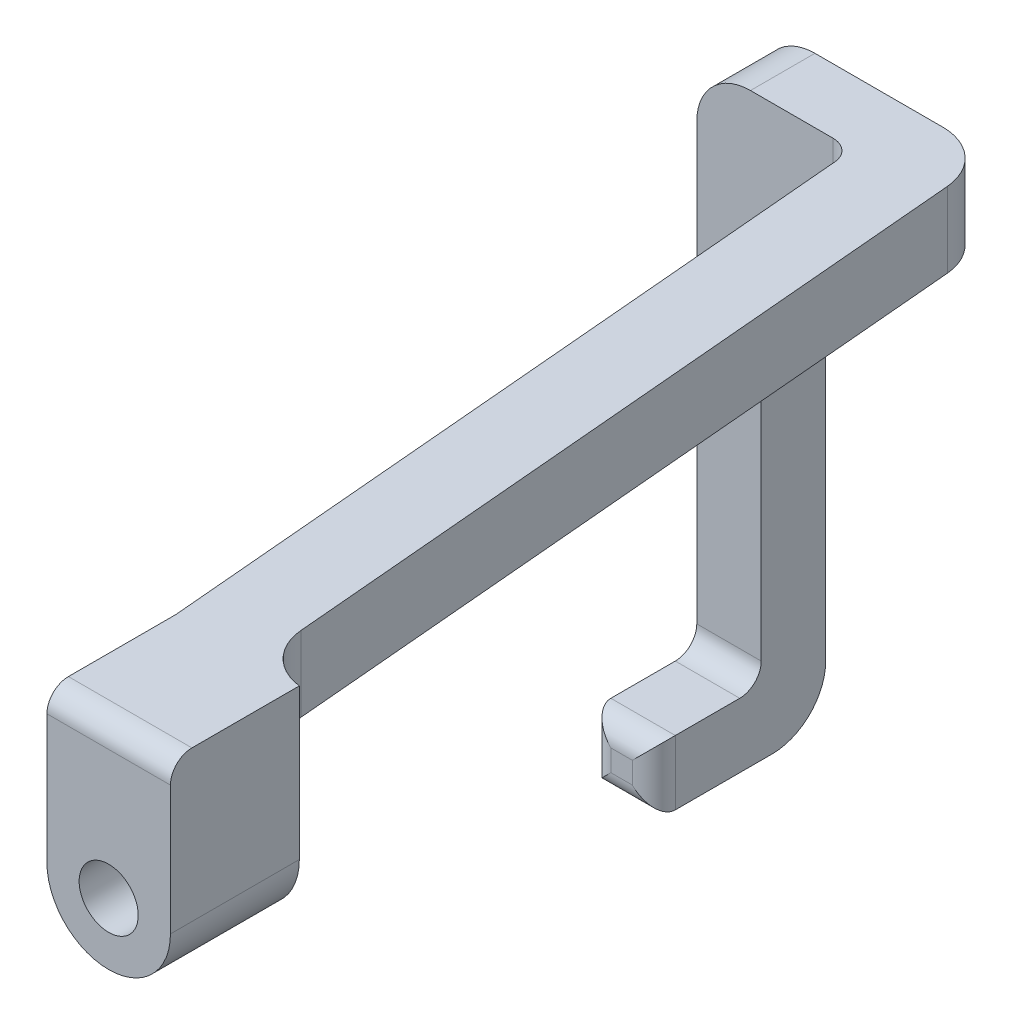
ISO-10303-21;
HEADER;
FILE_DESCRIPTION(('STEP AP214'),'2;1');
FILE_NAME('part.step','',(''),(''),'','','');
FILE_SCHEMA(('AUTOMOTIVE_DESIGN { 1 0 10303 214 1 1 1 1 }'));
ENDSEC;
DATA;
#1=APPLICATION_CONTEXT('core data for automotive mechanical design processes');
#2=APPLICATION_PROTOCOL_DEFINITION('international standard','automotive_design',2000,#1);
#3=PRODUCT_CONTEXT('',#1,'mechanical');
#4=PRODUCT('Part','Part','',(#3));
#5=PRODUCT_RELATED_PRODUCT_CATEGORY('part','',(#4));
#6=PRODUCT_DEFINITION_FORMATION('','',#4);
#7=PRODUCT_DEFINITION_CONTEXT('part definition',#1,'design');
#8=PRODUCT_DEFINITION('design','',#6,#7);
#9=PRODUCT_DEFINITION_SHAPE('','',#8);
#10=(LENGTH_UNIT() NAMED_UNIT(*) SI_UNIT(.MILLI.,.METRE.));
#11=(NAMED_UNIT(*) PLANE_ANGLE_UNIT() SI_UNIT($,.RADIAN.));
#12=(NAMED_UNIT(*) SI_UNIT($,.STERADIAN.) SOLID_ANGLE_UNIT());
#13=UNCERTAINTY_MEASURE_WITH_UNIT(LENGTH_MEASURE(1.E-05),#10,'distance_accuracy_value','');
#14=(GEOMETRIC_REPRESENTATION_CONTEXT(3) GLOBAL_UNCERTAINTY_ASSIGNED_CONTEXT((#13)) GLOBAL_UNIT_ASSIGNED_CONTEXT((#10,
#11,#12)) REPRESENTATION_CONTEXT('',''));
#15=CARTESIAN_POINT('',(0.,0.,0.));
#16=DIRECTION('',(0.,0.,1.));
#17=DIRECTION('',(1.,0.,0.));
#18=AXIS2_PLACEMENT_3D('',#15,#16,#17);
#19=CARTESIAN_POINT('',(-1.37658783702771,7.,-34.5));
#20=DIRECTION('',(0.,0.,-1.));
#21=DIRECTION('',(-1.,0.,0.));
#22=AXIS2_PLACEMENT_3D('',#19,#20,#21);
#23=PLANE('',#22);
#24=DIRECTION('',(-1.,0.,0.));
#25=VECTOR('',#24,1.);
#26=CARTESIAN_POINT('',(-1.37658783702771,3.5,-34.5));
#27=LINE('',#26,#25);
#28=CARTESIAN_POINT('',(-6.78208186315099,3.5,-34.5));
#29=VERTEX_POINT('',#28);
#30=CARTESIAN_POINT('',(-7.625,3.5,-34.5));
#31=VERTEX_POINT('',#30);
#32=EDGE_CURVE('E231',#29,#31,#27,.T.);
#33=ORIENTED_EDGE('',*,*,#32,.F.);
#34=DIRECTION('',(0.,-1.,0.));
#35=VECTOR('',#34,1.);
#36=CARTESIAN_POINT('',(-6.78208186315099,7.,-34.5));
#37=LINE('',#36,#35);
#38=CARTESIAN_POINT('',(-6.78208186315099,7.,-34.5));
#39=VERTEX_POINT('',#38);
#40=EDGE_CURVE('E459',#29,#39,#37,.F.);
#41=ORIENTED_EDGE('',*,*,#40,.T.);
#42=DIRECTION('',(-1.,0.,0.));
#43=VECTOR('',#42,1.);
#44=CARTESIAN_POINT('',(-1.37658783702771,7.,-34.5));
#45=LINE('',#44,#43);
#46=CARTESIAN_POINT('',(-10.625,7.,-34.5));
#47=VERTEX_POINT('',#46);
#48=EDGE_CURVE('E233',#39,#47,#45,.T.);
#49=ORIENTED_EDGE('',*,*,#48,.T.);
#50=CARTESIAN_POINT('',(-10.625,4.5,-34.5));
#51=DIRECTION('',(0.,0.,-1.));
#52=DIRECTION('',(-1.,0.,0.));
#53=AXIS2_PLACEMENT_3D('',#50,#51,#52);
#54=CIRCLE('',#53,2.5);
#55=CARTESIAN_POINT('',(-13.125,4.5,-34.5));
#56=VERTEX_POINT('',#55);
#57=EDGE_CURVE('E256',#47,#56,#54,.F.);
#58=ORIENTED_EDGE('',*,*,#57,.T.);
#59=DIRECTION('',(0.,-1.,0.));
#60=VECTOR('',#59,1.);
#61=CARTESIAN_POINT('',(-13.125,7.,-34.5));
#62=LINE('',#61,#60);
#63=CARTESIAN_POINT('',(-13.125,-15.75,-34.5));
#64=VERTEX_POINT('',#63);
#65=EDGE_CURVE('E235',#56,#64,#62,.T.);
#66=ORIENTED_EDGE('',*,*,#65,.T.);
#67=DIRECTION('',(-1.,0.,0.));
#68=VECTOR('',#67,1.);
#69=CARTESIAN_POINT('',(-10.125,-15.75,-34.5));
#70=LINE('',#69,#68);
#71=CARTESIAN_POINT('',(-10.125,-15.75,-34.5));
#72=VERTEX_POINT('',#71);
#73=EDGE_CURVE('E448',#64,#72,#70,.F.);
#74=ORIENTED_EDGE('',*,*,#73,.T.);
#75=DIRECTION('',(0.,1.,0.));
#76=VECTOR('',#75,1.);
#77=CARTESIAN_POINT('',(-10.125,-19.75,-34.5));
#78=LINE('',#77,#76);
#79=CARTESIAN_POINT('',(-10.125,0.999999999999994,-34.5));
#80=VERTEX_POINT('',#79);
#81=EDGE_CURVE('E437',#72,#80,#78,.T.);
#82=ORIENTED_EDGE('',*,*,#81,.T.);
#83=CARTESIAN_POINT('',(-7.625,1.,-34.5));
#84=DIRECTION('',(0.,0.,-1.));
#85=DIRECTION('',(-1.,0.,0.));
#86=AXIS2_PLACEMENT_3D('',#83,#84,#85);
#87=CIRCLE('',#86,2.5);
#88=EDGE_CURVE('E280',#80,#31,#87,.T.);
#89=ORIENTED_EDGE('',*,*,#88,.T.);
#90=EDGE_LOOP('',(#33,#41,#49,#58,#66,#74,#82,#89));
#91=FACE_BOUND('',#90,.T.);
#92=ADVANCED_FACE('F47',(#91),#23,.F.);
#93=CARTESIAN_POINT('',(-2.85356654462041,0.,0.247309100533769));
#94=DIRECTION('',(0.996265469182466,0.,-0.0863430073291471));
#95=DIRECTION('',(-0.0863430073291471,0.,-0.996265469182466));
#96=AXIS2_PLACEMENT_3D('',#93,#94,#95);
#97=PLANE('',#96);
#98=DIRECTION('',(-0.0863430073291471,0.,-0.996265469182466));
#99=VECTOR('',#98,1.);
#100=CARTESIAN_POINT('',(-2.875,7.,0.));
#101=LINE('',#100,#99);
#102=CARTESIAN_POINT('',(-2.875,7.,0.));
#103=VERTEX_POINT('',#102);
#104=CARTESIAN_POINT('',(-5.78581639396853,7.,-33.5863430073291));
#105=VERTEX_POINT('',#104);
#106=EDGE_CURVE('E404',#103,#105,#101,.T.);
#107=ORIENTED_EDGE('',*,*,#106,.T.);
#108=DIRECTION('',(0.,-1.,0.));
#109=VECTOR('',#108,1.);
#110=CARTESIAN_POINT('',(-5.78581639396853,3.5,-33.5863430073291));
#111=LINE('',#110,#109);
#112=CARTESIAN_POINT('',(-5.78581639396853,3.5,-33.5863430073291));
#113=VERTEX_POINT('',#112);
#114=EDGE_CURVE('E476',#105,#113,#111,.T.);
#115=ORIENTED_EDGE('',*,*,#114,.T.);
#116=DIRECTION('',(-0.086343007329147,0.,-0.996265469182466));
#117=VECTOR('',#116,1.);
#118=CARTESIAN_POINT('',(-2.875,3.5,0.));
#119=LINE('',#118,#117);
#120=CARTESIAN_POINT('',(-2.875,3.5,0.));
#121=VERTEX_POINT('',#120);
#122=EDGE_CURVE('E356',#121,#113,#119,.T.);
#123=ORIENTED_EDGE('',*,*,#122,.F.);
#124=DIRECTION('',(0.,1.,0.));
#125=VECTOR('',#124,1.);
#126=CARTESIAN_POINT('',(-2.875,0.,0.));
#127=LINE('',#126,#125);
#128=EDGE_CURVE('E242',#103,#121,#127,.F.);
#129=ORIENTED_EDGE('',*,*,#128,.F.);
#130=EDGE_LOOP('',(#107,#115,#123,#129));
#131=FACE_BOUND('',#130,.T.);
#132=ADVANCED_FACE('F317',(#131),#97,.F.);
#133=CARTESIAN_POINT('',(0.,0.,6.));
#134=DIRECTION('',(0.,0.,1.));
#135=DIRECTION('',(1.,0.,0.));
#136=AXIS2_PLACEMENT_3D('',#133,#134,#135);
#137=PLANE('',#136);
#138=DIRECTION('',(0.,1.,0.));
#139=VECTOR('',#138,1.);
#140=CARTESIAN_POINT('',(2.875,0.,6.));
#141=LINE('',#140,#139);
#142=CARTESIAN_POINT('',(2.875,0.,6.));
#143=VERTEX_POINT('',#142);
#144=CARTESIAN_POINT('',(2.875,6.,6.));
#145=VERTEX_POINT('',#144);
#146=EDGE_CURVE('E380',#143,#145,#141,.T.);
#147=ORIENTED_EDGE('',*,*,#146,.T.);
#148=DIRECTION('',(-1.,0.,0.));
#149=VECTOR('',#148,1.);
#150=CARTESIAN_POINT('',(-2.875,6.,6.));
#151=LINE('',#150,#149);
#152=CARTESIAN_POINT('',(-2.875,6.,6.));
#153=VERTEX_POINT('',#152);
#154=EDGE_CURVE('E478',#145,#153,#151,.T.);
#155=ORIENTED_EDGE('',*,*,#154,.T.);
#156=DIRECTION('',(0.,-1.,0.));
#157=VECTOR('',#156,1.);
#158=CARTESIAN_POINT('',(-2.875,0.,6.));
#159=LINE('',#158,#157);
#160=CARTESIAN_POINT('',(-2.875,0.,6.));
#161=VERTEX_POINT('',#160);
#162=EDGE_CURVE('E368',#153,#161,#159,.T.);
#163=ORIENTED_EDGE('',*,*,#162,.T.);
#164=CARTESIAN_POINT('',(0.,0.,6.));
#165=DIRECTION('',(0.,0.,1.));
#166=DIRECTION('',(1.,0.,0.));
#167=AXIS2_PLACEMENT_3D('',#164,#165,#166);
#168=CIRCLE('',#167,2.875);
#169=EDGE_CURVE('E383',#161,#143,#168,.T.);
#170=ORIENTED_EDGE('',*,*,#169,.T.);
#171=EDGE_LOOP('',(#147,#155,#163,#170));
#172=FACE_BOUND('',#171,.T.);
#173=CARTESIAN_POINT('',(0.,0.,6.));
#174=DIRECTION('',(0.,0.,1.));
#175=DIRECTION('',(1.,0.,0.));
#176=AXIS2_PLACEMENT_3D('',#173,#174,#175);
#177=CIRCLE('',#176,1.375);
#178=CARTESIAN_POINT('',(1.375,0.,6.));
#179=VERTEX_POINT('',#178);
#180=EDGE_CURVE('E378',#179,#179,#177,.T.);
#181=ORIENTED_EDGE('',*,*,#180,.F.);
#182=EDGE_LOOP('',(#181));
#183=FACE_BOUND('',#182,.T.);
#184=ADVANCED_FACE('F324',(#172,#183),#137,.T.);
#185=CARTESIAN_POINT('',(0.,0.,0.));
#186=DIRECTION('',(0.,0.,1.));
#187=DIRECTION('',(1.,0.,0.));
#188=AXIS2_PLACEMENT_3D('',#185,#186,#187);
#189=PLANE('',#188);
#190=DIRECTION('',(-1.,0.,0.));
#191=VECTOR('',#190,1.);
#192=CARTESIAN_POINT('',(-2.875,3.5,0.));
#193=LINE('',#192,#191);
#194=CARTESIAN_POINT('',(2.875,3.5,0.));
#195=VERTEX_POINT('',#194);
#196=EDGE_CURVE('E353',#195,#121,#193,.T.);
#197=ORIENTED_EDGE('',*,*,#196,.F.);
#198=DIRECTION('',(0.,1.,0.));
#199=VECTOR('',#198,1.);
#200=CARTESIAN_POINT('',(2.875,0.,0.));
#201=LINE('',#200,#199);
#202=CARTESIAN_POINT('',(2.875,0.,0.));
#203=VERTEX_POINT('',#202);
#204=EDGE_CURVE('E371',#203,#195,#201,.T.);
#205=ORIENTED_EDGE('',*,*,#204,.F.);
#206=CARTESIAN_POINT('',(0.,0.,0.));
#207=DIRECTION('',(0.,0.,1.));
#208=DIRECTION('',(1.,0.,0.));
#209=AXIS2_PLACEMENT_3D('',#206,#207,#208);
#210=CIRCLE('',#209,2.875);
#211=CARTESIAN_POINT('',(-2.875,0.,0.));
#212=VERTEX_POINT('',#211);
#213=EDGE_CURVE('E375',#212,#203,#210,.T.);
#214=ORIENTED_EDGE('',*,*,#213,.F.);
#215=DIRECTION('',(0.,-1.,0.));
#216=VECTOR('',#215,1.);
#217=CARTESIAN_POINT('',(-2.875,0.,0.));
#218=LINE('',#217,#216);
#219=EDGE_CURVE('E369',#121,#212,#218,.T.);
#220=ORIENTED_EDGE('',*,*,#219,.F.);
#221=EDGE_LOOP('',(#197,#205,#214,#220));
#222=FACE_BOUND('',#221,.T.);
#223=CARTESIAN_POINT('',(0.,0.,0.));
#224=DIRECTION('',(0.,0.,1.));
#225=DIRECTION('',(1.,0.,0.));
#226=AXIS2_PLACEMENT_3D('',#223,#224,#225);
#227=CIRCLE('',#226,1.375);
#228=CARTESIAN_POINT('',(1.375,0.,0.));
#229=VERTEX_POINT('',#228);
#230=EDGE_CURVE('E386',#229,#229,#227,.T.);
#231=ORIENTED_EDGE('',*,*,#230,.T.);
#232=EDGE_LOOP('',(#231));
#233=FACE_BOUND('',#232,.T.);
#234=ADVANCED_FACE('F327',(#222,#233),#189,.F.);
#235=CARTESIAN_POINT('',(0.,0.,6.));
#236=DIRECTION('',(0.,0.,-1.));
#237=DIRECTION('',(-1.,0.,0.));
#238=AXIS2_PLACEMENT_3D('',#235,#236,#237);
#239=CYLINDRICAL_SURFACE('',#238,2.875);
#240=ORIENTED_EDGE('',*,*,#213,.T.);
#241=DIRECTION('',(0.,0.,-1.));
#242=VECTOR('',#241,1.);
#243=CARTESIAN_POINT('',(2.875,0.,6.));
#244=LINE('',#243,#242);
#245=EDGE_CURVE('E361',#143,#203,#244,.T.);
#246=ORIENTED_EDGE('',*,*,#245,.F.);
#247=ORIENTED_EDGE('',*,*,#169,.F.);
#248=DIRECTION('',(0.,0.,-1.));
#249=VECTOR('',#248,1.);
#250=CARTESIAN_POINT('',(-2.875,0.,6.));
#251=LINE('',#250,#249);
#252=EDGE_CURVE('E360',#161,#212,#251,.T.);
#253=ORIENTED_EDGE('',*,*,#252,.T.);
#254=EDGE_LOOP('',(#240,#246,#247,#253));
#255=FACE_BOUND('',#254,.T.);
#256=ADVANCED_FACE('F331',(#255),#239,.T.);
#257=CARTESIAN_POINT('',(2.875,0.,6.));
#258=DIRECTION('',(-1.,0.,0.));
#259=DIRECTION('',(0.,-1.,0.));
#260=AXIS2_PLACEMENT_3D('',#257,#258,#259);
#261=PLANE('',#260);
#262=DIRECTION('',(0.,0.,-1.));
#263=VECTOR('',#262,1.);
#264=CARTESIAN_POINT('',(2.875,7.,6.));
#265=LINE('',#264,#263);
#266=CARTESIAN_POINT('',(2.875,7.,5.));
#267=VERTEX_POINT('',#266);
#268=CARTESIAN_POINT('',(2.875,7.,0.));
#269=VERTEX_POINT('',#268);
#270=EDGE_CURVE('E359',#267,#269,#265,.T.);
#271=ORIENTED_EDGE('',*,*,#270,.F.);
#272=CARTESIAN_POINT('',(2.875,6.,5.));
#273=DIRECTION('',(-1.,0.,0.));
#274=DIRECTION('',(0.,-1.,0.));
#275=AXIS2_PLACEMENT_3D('',#272,#273,#274);
#276=CIRCLE('',#275,1.);
#277=EDGE_CURVE('E488',#267,#145,#276,.F.);
#278=ORIENTED_EDGE('',*,*,#277,.T.);
#279=ORIENTED_EDGE('',*,*,#146,.F.);
#280=ORIENTED_EDGE('',*,*,#245,.T.);
#281=ORIENTED_EDGE('',*,*,#204,.T.);
#282=EDGE_CURVE('E374',#195,#269,#201,.T.);
#283=ORIENTED_EDGE('',*,*,#282,.T.);
#284=EDGE_LOOP('',(#271,#278,#279,#280,#281,#283));
#285=FACE_BOUND('',#284,.T.);
#286=ADVANCED_FACE('F339',(#285),#261,.F.);
#287=CARTESIAN_POINT('',(2.875,7.,6.));
#288=DIRECTION('',(0.,-1.,0.));
#289=DIRECTION('',(0.,0.,-1.));
#290=AXIS2_PLACEMENT_3D('',#287,#288,#289);
#291=PLANE('',#290);
#292=DIRECTION('',(0.,0.,-1.));
#293=VECTOR('',#292,1.);
#294=CARTESIAN_POINT('',(-2.875,7.,6.));
#295=LINE('',#294,#293);
#296=CARTESIAN_POINT('',(-2.875,7.,5.));
#297=VERTEX_POINT('',#296);
#298=EDGE_CURVE('E357',#297,#103,#295,.T.);
#299=ORIENTED_EDGE('',*,*,#298,.F.);
#300=DIRECTION('',(-1.,0.,0.));
#301=VECTOR('',#300,1.);
#302=CARTESIAN_POINT('',(2.875,7.,5.));
#303=LINE('',#302,#301);
#304=EDGE_CURVE('E64',#297,#267,#303,.F.);
#305=ORIENTED_EDGE('',*,*,#304,.T.);
#306=ORIENTED_EDGE('',*,*,#270,.T.);
#307=CARTESIAN_POINT('',(3.16921025672152,7.,-2.48262770564575));
#308=DIRECTION('',(0.,-1.,0.));
#309=DIRECTION('',(0.,0.,-1.));
#310=AXIS2_PLACEMENT_3D('',#307,#308,#309);
#311=CIRCLE('',#310,2.5);
#312=CARTESIAN_POINT('',(0.678546583765352,7.,-2.26677018732288));
#313=VERTEX_POINT('',#312);
#314=EDGE_CURVE('E286',#269,#313,#311,.T.);
#315=ORIENTED_EDGE('',*,*,#314,.T.);
#316=DIRECTION('',(-0.0863430073291471,0.,-0.996265469182466));
#317=VECTOR('',#316,1.);
#318=CARTESIAN_POINT('',(0.875000000000001,7.,0.));
#319=LINE('',#318,#317);
#320=CARTESIAN_POINT('',(-2.17704098492132,7.,-35.2158575183229));
#321=VERTEX_POINT('',#320);
#322=EDGE_CURVE('E222',#313,#321,#319,.T.);
#323=ORIENTED_EDGE('',*,*,#322,.T.);
#324=CARTESIAN_POINT('',(-4.66770465787748,7.,-35.));
#325=DIRECTION('',(0.,-1.,0.));
#326=DIRECTION('',(0.,0.,-1.));
#327=AXIS2_PLACEMENT_3D('',#324,#325,#326);
#328=CIRCLE('',#327,2.5);
#329=CARTESIAN_POINT('',(-4.66770465787748,7.,-37.5));
#330=VERTEX_POINT('',#329);
#331=EDGE_CURVE('E248',#321,#330,#328,.F.);
#332=ORIENTED_EDGE('',*,*,#331,.T.);
#333=DIRECTION('',(1.,0.,0.));
#334=VECTOR('',#333,1.);
#335=CARTESIAN_POINT('',(-2.375,7.,-37.5));
#336=LINE('',#335,#334);
#337=CARTESIAN_POINT('',(-6.125,7.,-37.5));
#338=VERTEX_POINT('',#337);
#339=EDGE_CURVE('E221',#338,#330,#336,.T.);
#340=ORIENTED_EDGE('',*,*,#339,.F.);
#341=DIRECTION('',(1.,0.,0.));
#342=VECTOR('',#341,1.);
#343=CARTESIAN_POINT('',(-13.125,7.,-37.5));
#344=LINE('',#343,#342);
#345=CARTESIAN_POINT('',(-10.625,7.,-37.5));
#346=VERTEX_POINT('',#345);
#347=EDGE_CURVE('E232',#346,#338,#344,.T.);
#348=ORIENTED_EDGE('',*,*,#347,.F.);
#349=DIRECTION('',(0.,0.,1.));
#350=VECTOR('',#349,1.);
#351=CARTESIAN_POINT('',(-10.625,7.,6.));
#352=LINE('',#351,#350);
#353=EDGE_CURVE('E250',#346,#47,#352,.T.);
#354=ORIENTED_EDGE('',*,*,#353,.T.);
#355=ORIENTED_EDGE('',*,*,#48,.F.);
#356=CARTESIAN_POINT('',(-6.78208186315099,7.,-33.5));
#357=DIRECTION('',(0.,-1.,0.));
#358=DIRECTION('',(0.,0.,-1.));
#359=AXIS2_PLACEMENT_3D('',#356,#357,#358);
#360=CIRCLE('',#359,1.);
#361=EDGE_CURVE('E408',#39,#105,#360,.T.);
#362=ORIENTED_EDGE('',*,*,#361,.T.);
#363=ORIENTED_EDGE('',*,*,#106,.F.);
#364=EDGE_LOOP('',(#299,#305,#306,#315,#323,#332,#340,#348,#354,#355,#362,#363));
#365=FACE_BOUND('',#364,.T.);
#366=ADVANCED_FACE('F335',(#365),#291,.F.);
#367=CARTESIAN_POINT('',(-2.875,0.,6.));
#368=DIRECTION('',(1.,0.,0.));
#369=DIRECTION('',(0.,1.,0.));
#370=AXIS2_PLACEMENT_3D('',#367,#368,#369);
#371=PLANE('',#370);
#372=ORIENTED_EDGE('',*,*,#162,.F.);
#373=CARTESIAN_POINT('',(-2.875,6.,5.));
#374=DIRECTION('',(1.,0.,0.));
#375=DIRECTION('',(0.,1.,0.));
#376=AXIS2_PLACEMENT_3D('',#373,#374,#375);
#377=CIRCLE('',#376,1.);
#378=EDGE_CURVE('E72',#153,#297,#377,.F.);
#379=ORIENTED_EDGE('',*,*,#378,.T.);
#380=ORIENTED_EDGE('',*,*,#298,.T.);
#381=ORIENTED_EDGE('',*,*,#128,.T.);
#382=ORIENTED_EDGE('',*,*,#219,.T.);
#383=ORIENTED_EDGE('',*,*,#252,.F.);
#384=EDGE_LOOP('',(#372,#379,#380,#381,#382,#383));
#385=FACE_BOUND('',#384,.T.);
#386=ADVANCED_FACE('F322',(#385),#371,.F.);
#387=CARTESIAN_POINT('',(0.,0.,6.));
#388=DIRECTION('',(0.,0.,-1.));
#389=DIRECTION('',(-1.,0.,0.));
#390=AXIS2_PLACEMENT_3D('',#387,#388,#389);
#391=CYLINDRICAL_SURFACE('',#390,1.375);
#392=ORIENTED_EDGE('',*,*,#180,.T.);
#393=EDGE_LOOP('',(#392));
#394=FACE_BOUND('',#393,.T.);
#395=ORIENTED_EDGE('',*,*,#230,.F.);
#396=EDGE_LOOP('',(#395));
#397=FACE_BOUND('',#396,.T.);
#398=ADVANCED_FACE('F316',(#394,#397),#391,.F.);
#399=CARTESIAN_POINT('',(0.,0.,-37.5));
#400=DIRECTION('',(0.,0.,1.));
#401=DIRECTION('',(1.,0.,0.));
#402=AXIS2_PLACEMENT_3D('',#399,#400,#401);
#403=PLANE('',#402);
#404=DIRECTION('',(0.,1.,0.));
#405=VECTOR('',#404,1.);
#406=CARTESIAN_POINT('',(-13.125,7.,-37.5));
#407=LINE('',#406,#405);
#408=CARTESIAN_POINT('',(-13.125,-17.25,-37.5));
#409=VERTEX_POINT('',#408);
#410=CARTESIAN_POINT('',(-13.125,4.5,-37.5));
#411=VERTEX_POINT('',#410);
#412=EDGE_CURVE('E451',#409,#411,#407,.T.);
#413=ORIENTED_EDGE('',*,*,#412,.T.);
#414=CARTESIAN_POINT('',(-10.625,4.5,-37.5));
#415=DIRECTION('',(0.,0.,1.));
#416=DIRECTION('',(1.,0.,0.));
#417=AXIS2_PLACEMENT_3D('',#414,#415,#416);
#418=CIRCLE('',#417,2.5);
#419=EDGE_CURVE('E268',#411,#346,#418,.F.);
#420=ORIENTED_EDGE('',*,*,#419,.T.);
#421=ORIENTED_EDGE('',*,*,#347,.T.);
#422=ORIENTED_EDGE('',*,*,#339,.T.);
#423=DIRECTION('',(0.,-1.,0.));
#424=VECTOR('',#423,1.);
#425=CARTESIAN_POINT('',(-4.66770465787748,0.,-37.5));
#426=LINE('',#425,#424);
#427=CARTESIAN_POINT('',(-4.66770465787748,3.5,-37.5));
#428=VERTEX_POINT('',#427);
#429=EDGE_CURVE('E218',#330,#428,#426,.T.);
#430=ORIENTED_EDGE('',*,*,#429,.T.);
#431=DIRECTION('',(-1.,0.,0.));
#432=VECTOR('',#431,1.);
#433=CARTESIAN_POINT('',(-6.125,3.5,-37.5));
#434=LINE('',#433,#432);
#435=CARTESIAN_POINT('',(-6.125,3.5,-37.5));
#436=VERTEX_POINT('',#435);
#437=EDGE_CURVE('E210',#428,#436,#434,.T.);
#438=ORIENTED_EDGE('',*,*,#437,.T.);
#439=DIRECTION('',(1.,0.,0.));
#440=VECTOR('',#439,1.);
#441=CARTESIAN_POINT('',(-13.125,3.5,-37.5));
#442=LINE('',#441,#440);
#443=CARTESIAN_POINT('',(-7.625,3.5,-37.5));
#444=VERTEX_POINT('',#443);
#445=EDGE_CURVE('E215',#444,#436,#442,.T.);
#446=ORIENTED_EDGE('',*,*,#445,.F.);
#447=CARTESIAN_POINT('',(-7.625,1.,-37.5));
#448=DIRECTION('',(0.,0.,1.));
#449=DIRECTION('',(1.,0.,0.));
#450=AXIS2_PLACEMENT_3D('',#447,#448,#449);
#451=CIRCLE('',#450,2.5);
#452=CARTESIAN_POINT('',(-10.125,0.999999999999994,-37.5));
#453=VERTEX_POINT('',#452);
#454=EDGE_CURVE('E278',#444,#453,#451,.T.);
#455=ORIENTED_EDGE('',*,*,#454,.T.);
#456=DIRECTION('',(0.,1.,0.));
#457=VECTOR('',#456,1.);
#458=CARTESIAN_POINT('',(-10.125,-19.75,-37.5));
#459=LINE('',#458,#457);
#460=CARTESIAN_POINT('',(-10.125,-17.25,-37.5));
#461=VERTEX_POINT('',#460);
#462=EDGE_CURVE('E440',#461,#453,#459,.T.);
#463=ORIENTED_EDGE('',*,*,#462,.F.);
#464=DIRECTION('',(-1.,0.,0.));
#465=VECTOR('',#464,1.);
#466=CARTESIAN_POINT('',(0.,-17.25,-37.5));
#467=LINE('',#466,#465);
#468=EDGE_CURVE('E263',#461,#409,#467,.T.);
#469=ORIENTED_EDGE('',*,*,#468,.T.);
#470=EDGE_LOOP('',(#413,#420,#421,#422,#430,#438,#446,#455,#463,#469));
#471=FACE_BOUND('',#470,.T.);
#472=ADVANCED_FACE('F214',(#471),#403,.F.);
#473=CARTESIAN_POINT('',(0.,3.5,0.));
#474=DIRECTION('',(0.,1.,0.));
#475=DIRECTION('',(-1.,0.,0.));
#476=AXIS2_PLACEMENT_3D('',#473,#474,#475);
#477=PLANE('',#476);
#478=ORIENTED_EDGE('',*,*,#122,.T.);
#479=CARTESIAN_POINT('',(-6.78208186315099,3.5,-33.5));
#480=DIRECTION('',(0.,1.,0.));
#481=DIRECTION('',(-1.,0.,0.));
#482=AXIS2_PLACEMENT_3D('',#479,#480,#481);
#483=CIRCLE('',#482,1.);
#484=EDGE_CURVE('E490',#113,#29,#483,.T.);
#485=ORIENTED_EDGE('',*,*,#484,.T.);
#486=ORIENTED_EDGE('',*,*,#32,.T.);
#487=DIRECTION('',(0.,0.,-1.));
#488=VECTOR('',#487,1.);
#489=CARTESIAN_POINT('',(-7.625,3.5,0.));
#490=LINE('',#489,#488);
#491=EDGE_CURVE('E230',#31,#444,#490,.T.);
#492=ORIENTED_EDGE('',*,*,#491,.T.);
#493=ORIENTED_EDGE('',*,*,#445,.T.);
#494=ORIENTED_EDGE('',*,*,#437,.F.);
#495=CARTESIAN_POINT('',(-4.66770465787748,3.5,-35.));
#496=DIRECTION('',(0.,1.,0.));
#497=DIRECTION('',(-1.,0.,0.));
#498=AXIS2_PLACEMENT_3D('',#495,#496,#497);
#499=CIRCLE('',#498,2.5);
#500=CARTESIAN_POINT('',(-2.17704098492132,3.5,-35.2158575183229));
#501=VERTEX_POINT('',#500);
#502=EDGE_CURVE('E364',#428,#501,#499,.F.);
#503=ORIENTED_EDGE('',*,*,#502,.T.);
#504=DIRECTION('',(-0.086343007329147,0.,-0.996265469182466));
#505=VECTOR('',#504,1.);
#506=CARTESIAN_POINT('',(0.875000000000001,3.5,0.));
#507=LINE('',#506,#505);
#508=CARTESIAN_POINT('',(0.678546583765352,3.5,-2.26677018732288));
#509=VERTEX_POINT('',#508);
#510=EDGE_CURVE('E409',#509,#501,#507,.T.);
#511=ORIENTED_EDGE('',*,*,#510,.F.);
#512=CARTESIAN_POINT('',(3.16921025672152,3.5,-2.48262770564575));
#513=DIRECTION('',(0.,1.,0.));
#514=DIRECTION('',(-1.,0.,0.));
#515=AXIS2_PLACEMENT_3D('',#512,#513,#514);
#516=CIRCLE('',#515,2.5);
#517=EDGE_CURVE('E283',#509,#195,#516,.T.);
#518=ORIENTED_EDGE('',*,*,#517,.T.);
#519=ORIENTED_EDGE('',*,*,#196,.T.);
#520=EDGE_LOOP('',(#478,#485,#486,#492,#493,#494,#503,#511,#518,#519));
#521=FACE_BOUND('',#520,.T.);
#522=ADVANCED_FACE('F228',(#521),#477,.F.);
#523=CARTESIAN_POINT('',(0.86847677444969,0.,-0.0752679871189732));
#524=DIRECTION('',(-0.996265469182466,0.,0.086343007329147));
#525=DIRECTION('',(0.086343007329147,0.,0.996265469182466));
#526=AXIS2_PLACEMENT_3D('',#523,#524,#525);
#527=PLANE('',#526);
#528=ORIENTED_EDGE('',*,*,#510,.T.);
#529=DIRECTION('',(0.,-1.,0.));
#530=VECTOR('',#529,1.);
#531=CARTESIAN_POINT('',(-2.17704098492131,0.,-35.2158575183229));
#532=LINE('',#531,#530);
#533=EDGE_CURVE('E276',#501,#321,#532,.F.);
#534=ORIENTED_EDGE('',*,*,#533,.T.);
#535=ORIENTED_EDGE('',*,*,#322,.F.);
#536=DIRECTION('',(0.,-1.,0.));
#537=VECTOR('',#536,1.);
#538=CARTESIAN_POINT('',(0.678546583765352,0.,-2.26677018732288));
#539=LINE('',#538,#537);
#540=EDGE_CURVE('E273',#313,#509,#539,.T.);
#541=ORIENTED_EDGE('',*,*,#540,.T.);
#542=EDGE_LOOP('',(#528,#534,#535,#541));
#543=FACE_BOUND('',#542,.T.);
#544=ADVANCED_FACE('F575',(#543),#527,.F.);
#545=CARTESIAN_POINT('',(-13.125,0.,0.));
#546=DIRECTION('',(1.,0.,0.));
#547=DIRECTION('',(0.,0.,-1.));
#548=AXIS2_PLACEMENT_3D('',#545,#546,#547);
#549=PLANE('',#548);
#550=DIRECTION('',(0.,0.,1.));
#551=VECTOR('',#550,1.);
#552=CARTESIAN_POINT('',(-13.125,-19.75,0.));
#553=LINE('',#552,#551);
#554=CARTESIAN_POINT('',(-13.125,-19.75,-35.));
#555=VERTEX_POINT('',#554);
#556=CARTESIAN_POINT('',(-13.125,-19.75,-30.5));
#557=VERTEX_POINT('',#556);
#558=EDGE_CURVE('E453',#555,#557,#553,.T.);
#559=ORIENTED_EDGE('',*,*,#558,.T.);
#560=DIRECTION('',(0.,-1.,0.));
#561=VECTOR('',#560,1.);
#562=CARTESIAN_POINT('',(-13.125,0.,-30.5));
#563=LINE('',#562,#561);
#564=CARTESIAN_POINT('',(-13.125,-16.75,-30.5));
#565=VERTEX_POINT('',#564);
#566=EDGE_CURVE('E516',#557,#565,#563,.F.);
#567=ORIENTED_EDGE('',*,*,#566,.T.);
#568=DIRECTION('',(0.,0.,-1.));
#569=VECTOR('',#568,1.);
#570=CARTESIAN_POINT('',(-13.125,-16.75,-29.5));
#571=LINE('',#570,#569);
#572=CARTESIAN_POINT('',(-13.125,-16.75,-33.5));
#573=VERTEX_POINT('',#572);
#574=EDGE_CURVE('E510',#565,#573,#571,.T.);
#575=ORIENTED_EDGE('',*,*,#574,.T.);
#576=CARTESIAN_POINT('',(-13.125,-15.75,-33.5));
#577=DIRECTION('',(1.,0.,0.));
#578=DIRECTION('',(0.,0.,-1.));
#579=AXIS2_PLACEMENT_3D('',#576,#577,#578);
#580=CIRCLE('',#579,1.);
#581=EDGE_CURVE('E56',#573,#64,#580,.T.);
#582=ORIENTED_EDGE('',*,*,#581,.T.);
#583=ORIENTED_EDGE('',*,*,#65,.F.);
#584=DIRECTION('',(0.,0.,1.));
#585=VECTOR('',#584,1.);
#586=CARTESIAN_POINT('',(-13.125,4.5,0.));
#587=LINE('',#586,#585);
#588=EDGE_CURVE('E260',#56,#411,#587,.F.);
#589=ORIENTED_EDGE('',*,*,#588,.T.);
#590=ORIENTED_EDGE('',*,*,#412,.F.);
#591=CARTESIAN_POINT('',(-13.125,-17.25,-35.));
#592=DIRECTION('',(1.,0.,0.));
#593=DIRECTION('',(0.,0.,-1.));
#594=AXIS2_PLACEMENT_3D('',#591,#592,#593);
#595=CIRCLE('',#594,2.5);
#596=EDGE_CURVE('E258',#409,#555,#595,.F.);
#597=ORIENTED_EDGE('',*,*,#596,.T.);
#598=EDGE_LOOP('',(#559,#567,#575,#582,#583,#589,#590,#597));
#599=FACE_BOUND('',#598,.T.);
#600=ADVANCED_FACE('F469',(#599),#549,.F.);
#601=CARTESIAN_POINT('',(-10.125,-19.75,0.));
#602=DIRECTION('',(1.,0.,0.));
#603=DIRECTION('',(0.,0.,-1.));
#604=AXIS2_PLACEMENT_3D('',#601,#602,#603);
#605=PLANE('',#604);
#606=DIRECTION('',(0.,0.,-1.));
#607=VECTOR('',#606,1.);
#608=CARTESIAN_POINT('',(-10.125,-16.75,-29.5));
#609=LINE('',#608,#607);
#610=CARTESIAN_POINT('',(-10.125,-16.75,-30.5));
#611=VERTEX_POINT('',#610);
#612=CARTESIAN_POINT('',(-10.125,-16.75,-33.5));
#613=VERTEX_POINT('',#612);
#614=EDGE_CURVE('E504',#611,#613,#609,.T.);
#615=ORIENTED_EDGE('',*,*,#614,.F.);
#616=DIRECTION('',(0.,1.,0.));
#617=VECTOR('',#616,1.);
#618=CARTESIAN_POINT('',(-10.125,-19.75,-30.5));
#619=LINE('',#618,#617);
#620=CARTESIAN_POINT('',(-10.125,-19.75,-30.5));
#621=VERTEX_POINT('',#620);
#622=EDGE_CURVE('E527',#611,#621,#619,.F.);
#623=ORIENTED_EDGE('',*,*,#622,.T.);
#624=DIRECTION('',(0.,0.,-1.));
#625=VECTOR('',#624,1.);
#626=CARTESIAN_POINT('',(-10.125,-19.75,0.));
#627=LINE('',#626,#625);
#628=CARTESIAN_POINT('',(-10.125,-19.75,-35.));
#629=VERTEX_POINT('',#628);
#630=EDGE_CURVE('E449',#621,#629,#627,.T.);
#631=ORIENTED_EDGE('',*,*,#630,.T.);
#632=CARTESIAN_POINT('',(-10.125,-17.25,-35.));
#633=DIRECTION('',(1.,0.,0.));
#634=DIRECTION('',(0.,0.,-1.));
#635=AXIS2_PLACEMENT_3D('',#632,#633,#634);
#636=CIRCLE('',#635,2.5);
#637=EDGE_CURVE('E428',#629,#461,#636,.T.);
#638=ORIENTED_EDGE('',*,*,#637,.T.);
#639=ORIENTED_EDGE('',*,*,#462,.T.);
#640=DIRECTION('',(0.,0.,-1.));
#641=VECTOR('',#640,1.);
#642=CARTESIAN_POINT('',(-10.125,1.,0.));
#643=LINE('',#642,#641);
#644=EDGE_CURVE('E251',#453,#80,#643,.F.);
#645=ORIENTED_EDGE('',*,*,#644,.T.);
#646=ORIENTED_EDGE('',*,*,#81,.F.);
#647=CARTESIAN_POINT('',(-10.125,-15.75,-33.5));
#648=DIRECTION('',(1.,0.,0.));
#649=DIRECTION('',(0.,0.,-1.));
#650=AXIS2_PLACEMENT_3D('',#647,#648,#649);
#651=CIRCLE('',#650,1.);
#652=EDGE_CURVE('E12',#72,#613,#651,.F.);
#653=ORIENTED_EDGE('',*,*,#652,.T.);
#654=EDGE_LOOP('',(#615,#623,#631,#638,#639,#645,#646,#653));
#655=FACE_BOUND('',#654,.T.);
#656=ADVANCED_FACE('F436',(#655),#605,.T.);
#657=CARTESIAN_POINT('',(0.,-19.75,0.));
#658=DIRECTION('',(0.,1.,0.));
#659=DIRECTION('',(-1.,0.,0.));
#660=AXIS2_PLACEMENT_3D('',#657,#658,#659);
#661=PLANE('',#660);
#662=ORIENTED_EDGE('',*,*,#630,.F.);
#663=DIRECTION('',(1.,0.,0.));
#664=VECTOR('',#663,1.);
#665=CARTESIAN_POINT('',(0.,-19.75,-30.5));
#666=LINE('',#665,#664);
#667=EDGE_CURVE('E524',#621,#557,#666,.F.);
#668=ORIENTED_EDGE('',*,*,#667,.T.);
#669=ORIENTED_EDGE('',*,*,#558,.F.);
#670=DIRECTION('',(-1.,0.,0.));
#671=VECTOR('',#670,1.);
#672=CARTESIAN_POINT('',(0.,-19.75,-35.));
#673=LINE('',#672,#671);
#674=EDGE_CURVE('E270',#555,#629,#673,.F.);
#675=ORIENTED_EDGE('',*,*,#674,.T.);
#676=EDGE_LOOP('',(#662,#668,#669,#675));
#677=FACE_BOUND('',#676,.T.);
#678=ADVANCED_FACE('F550',(#677),#661,.F.);
#679=CARTESIAN_POINT('',(-13.125,-16.75,-29.5));
#680=DIRECTION('',(0.,-1.,0.));
#681=DIRECTION('',(0.,0.,-1.));
#682=AXIS2_PLACEMENT_3D('',#679,#680,#681);
#683=PLANE('',#682);
#684=ORIENTED_EDGE('',*,*,#574,.F.);
#685=DIRECTION('',(-1.,0.,0.));
#686=VECTOR('',#685,1.);
#687=CARTESIAN_POINT('',(-13.125,-16.75,-30.5));
#688=LINE('',#687,#686);
#689=EDGE_CURVE('E480',#565,#611,#688,.F.);
#690=ORIENTED_EDGE('',*,*,#689,.T.);
#691=ORIENTED_EDGE('',*,*,#614,.T.);
#692=DIRECTION('',(-1.,0.,0.));
#693=VECTOR('',#692,1.);
#694=CARTESIAN_POINT('',(-13.125,-16.75,-33.5));
#695=LINE('',#694,#693);
#696=EDGE_CURVE('E523',#613,#573,#695,.T.);
#697=ORIENTED_EDGE('',*,*,#696,.T.);
#698=EDGE_LOOP('',(#684,#690,#691,#697));
#699=FACE_BOUND('',#698,.T.);
#700=ADVANCED_FACE('F530',(#699),#683,.F.);
#701=CARTESIAN_POINT('',(0.,0.,-29.5));
#702=DIRECTION('',(0.,0.,-1.));
#703=DIRECTION('',(-1.,0.,0.));
#704=AXIS2_PLACEMENT_3D('',#701,#702,#703);
#705=PLANE('',#704);
#706=DIRECTION('',(1.,0.,0.));
#707=VECTOR('',#706,1.);
#708=CARTESIAN_POINT('',(0.,-18.75,-29.5));
#709=LINE('',#708,#707);
#710=CARTESIAN_POINT('',(-12.125,-18.75,-29.5));
#711=VERTEX_POINT('',#710);
#712=CARTESIAN_POINT('',(-11.125,-18.75,-29.5));
#713=VERTEX_POINT('',#712);
#714=EDGE_CURVE('E545',#711,#713,#709,.T.);
#715=ORIENTED_EDGE('',*,*,#714,.T.);
#716=DIRECTION('',(0.,1.,0.));
#717=VECTOR('',#716,1.);
#718=CARTESIAN_POINT('',(-11.125,-16.75,-29.5));
#719=LINE('',#718,#717);
#720=CARTESIAN_POINT('',(-11.125,-17.75,-29.5));
#721=VERTEX_POINT('',#720);
#722=EDGE_CURVE('E539',#713,#721,#719,.T.);
#723=ORIENTED_EDGE('',*,*,#722,.T.);
#724=DIRECTION('',(-1.,0.,0.));
#725=VECTOR('',#724,1.);
#726=CARTESIAN_POINT('',(0.,-17.75,-29.5));
#727=LINE('',#726,#725);
#728=CARTESIAN_POINT('',(-12.125,-17.75,-29.5));
#729=VERTEX_POINT('',#728);
#730=EDGE_CURVE('E287',#721,#729,#727,.T.);
#731=ORIENTED_EDGE('',*,*,#730,.T.);
#732=DIRECTION('',(0.,-1.,0.));
#733=VECTOR('',#732,1.);
#734=CARTESIAN_POINT('',(-12.125,0.,-29.5));
#735=LINE('',#734,#733);
#736=EDGE_CURVE('E543',#729,#711,#735,.T.);
#737=ORIENTED_EDGE('',*,*,#736,.T.);
#738=EDGE_LOOP('',(#715,#723,#731,#737));
#739=FACE_BOUND('',#738,.T.);
#740=ADVANCED_FACE('F544',(#739),#705,.F.);
#741=CARTESIAN_POINT('',(-7.625,1.,0.));
#742=DIRECTION('',(0.,0.,-1.));
#743=DIRECTION('',(0.,1.,0.));
#744=AXIS2_PLACEMENT_3D('',#741,#742,#743);
#745=CYLINDRICAL_SURFACE('',#744,2.5);
#746=ORIENTED_EDGE('',*,*,#88,.F.);
#747=ORIENTED_EDGE('',*,*,#644,.F.);
#748=ORIENTED_EDGE('',*,*,#454,.F.);
#749=ORIENTED_EDGE('',*,*,#491,.F.);
#750=EDGE_LOOP('',(#746,#747,#748,#749));
#751=FACE_BOUND('',#750,.T.);
#752=ADVANCED_FACE('F442',(#751),#745,.F.);
#753=CARTESIAN_POINT('',(-10.625,4.5,6.));
#754=DIRECTION('',(0.,0.,1.));
#755=DIRECTION('',(1.,0.,0.));
#756=AXIS2_PLACEMENT_3D('',#753,#754,#755);
#757=CYLINDRICAL_SURFACE('',#756,2.5);
#758=ORIENTED_EDGE('',*,*,#419,.F.);
#759=ORIENTED_EDGE('',*,*,#588,.F.);
#760=ORIENTED_EDGE('',*,*,#57,.F.);
#761=ORIENTED_EDGE('',*,*,#353,.F.);
#762=EDGE_LOOP('',(#758,#759,#760,#761));
#763=FACE_BOUND('',#762,.T.);
#764=ADVANCED_FACE('F464',(#763),#757,.T.);
#765=CARTESIAN_POINT('',(0.,-17.25,-35.));
#766=DIRECTION('',(-1.,0.,0.));
#767=DIRECTION('',(0.,-1.,0.));
#768=AXIS2_PLACEMENT_3D('',#765,#766,#767);
#769=CYLINDRICAL_SURFACE('',#768,2.5);
#770=ORIENTED_EDGE('',*,*,#637,.F.);
#771=ORIENTED_EDGE('',*,*,#674,.F.);
#772=ORIENTED_EDGE('',*,*,#596,.F.);
#773=ORIENTED_EDGE('',*,*,#468,.F.);
#774=EDGE_LOOP('',(#770,#771,#772,#773));
#775=FACE_BOUND('',#774,.T.);
#776=ADVANCED_FACE('F553',(#775),#769,.T.);
#777=CARTESIAN_POINT('',(-4.66770465787748,0.,-35.));
#778=DIRECTION('',(0.,-1.,0.));
#779=DIRECTION('',(0.,0.,-1.));
#780=AXIS2_PLACEMENT_3D('',#777,#778,#779);
#781=CYLINDRICAL_SURFACE('',#780,2.5);
#782=ORIENTED_EDGE('',*,*,#331,.F.);
#783=ORIENTED_EDGE('',*,*,#533,.F.);
#784=ORIENTED_EDGE('',*,*,#502,.F.);
#785=ORIENTED_EDGE('',*,*,#429,.F.);
#786=EDGE_LOOP('',(#782,#783,#784,#785));
#787=FACE_BOUND('',#786,.T.);
#788=ADVANCED_FACE('F555',(#787),#781,.T.);
#789=CARTESIAN_POINT('',(3.16921025672152,0.,-2.48262770564575));
#790=DIRECTION('',(0.,-1.,0.));
#791=DIRECTION('',(1.,0.,0.));
#792=AXIS2_PLACEMENT_3D('',#789,#790,#791);
#793=CYLINDRICAL_SURFACE('',#792,2.5);
#794=ORIENTED_EDGE('',*,*,#314,.F.);
#795=ORIENTED_EDGE('',*,*,#282,.F.);
#796=ORIENTED_EDGE('',*,*,#517,.F.);
#797=ORIENTED_EDGE('',*,*,#540,.F.);
#798=EDGE_LOOP('',(#794,#795,#796,#797));
#799=FACE_BOUND('',#798,.T.);
#800=ADVANCED_FACE('F561',(#799),#793,.F.);
#801=CARTESIAN_POINT('',(-12.125,0.,-30.5));
#802=DIRECTION('',(0.,-1.,0.));
#803=DIRECTION('',(0.,0.,-1.));
#804=AXIS2_PLACEMENT_3D('',#801,#802,#803);
#805=CYLINDRICAL_SURFACE('',#804,1.);
#806=CARTESIAN_POINT('',(-12.125,-17.75,-30.5));
#807=DIRECTION('',(-0.707106781186547,-0.707106781186547,0.));
#808=DIRECTION('',(-0.707106781186547,0.707106781186547,0.));
#809=AXIS2_PLACEMENT_3D('',#806,#807,#808);
#810=ELLIPSE('',#809,1.41421356237309,1.);
#811=EDGE_CURVE('E497',#565,#729,#810,.F.);
#812=ORIENTED_EDGE('',*,*,#811,.F.);
#813=ORIENTED_EDGE('',*,*,#566,.F.);
#814=CARTESIAN_POINT('',(-12.125,-18.75,-30.5));
#815=DIRECTION('',(0.707106781186547,-0.707106781186548,0.));
#816=DIRECTION('',(-0.707106781186548,-0.707106781186547,0.));
#817=AXIS2_PLACEMENT_3D('',#814,#815,#816);
#818=ELLIPSE('',#817,1.41421356237309,1.);
#819=EDGE_CURVE('E51',#711,#557,#818,.T.);
#820=ORIENTED_EDGE('',*,*,#819,.F.);
#821=ORIENTED_EDGE('',*,*,#736,.F.);
#822=EDGE_LOOP('',(#812,#813,#820,#821));
#823=FACE_BOUND('',#822,.T.);
#824=ADVANCED_FACE('F521',(#823),#805,.T.);
#825=CARTESIAN_POINT('',(0.,-18.75,-30.5));
#826=DIRECTION('',(1.,0.,0.));
#827=DIRECTION('',(0.,1.,0.));
#828=AXIS2_PLACEMENT_3D('',#825,#826,#827);
#829=CYLINDRICAL_SURFACE('',#828,1.);
#830=ORIENTED_EDGE('',*,*,#819,.T.);
#831=ORIENTED_EDGE('',*,*,#667,.F.);
#832=CARTESIAN_POINT('',(-11.125,-18.75,-30.5));
#833=DIRECTION('',(0.707106781186548,0.707106781186547,0.));
#834=DIRECTION('',(0.707106781186547,-0.707106781186548,0.));
#835=AXIS2_PLACEMENT_3D('',#832,#833,#834);
#836=ELLIPSE('',#835,1.4142135623731,1.);
#837=EDGE_CURVE('E496',#713,#621,#836,.T.);
#838=ORIENTED_EDGE('',*,*,#837,.F.);
#839=ORIENTED_EDGE('',*,*,#714,.F.);
#840=EDGE_LOOP('',(#830,#831,#838,#839));
#841=FACE_BOUND('',#840,.T.);
#842=ADVANCED_FACE('F549',(#841),#829,.T.);
#843=CARTESIAN_POINT('',(0.,-17.75,-30.5));
#844=DIRECTION('',(-1.,0.,0.));
#845=DIRECTION('',(0.,0.,1.));
#846=AXIS2_PLACEMENT_3D('',#843,#844,#845);
#847=CYLINDRICAL_SURFACE('',#846,1.);
#848=ORIENTED_EDGE('',*,*,#811,.T.);
#849=ORIENTED_EDGE('',*,*,#730,.F.);
#850=CARTESIAN_POINT('',(-11.125,-17.75,-30.5));
#851=DIRECTION('',(-0.707106781186547,0.707106781186547,0.));
#852=DIRECTION('',(-0.707106781186547,-0.707106781186547,0.));
#853=AXIS2_PLACEMENT_3D('',#850,#851,#852);
#854=ELLIPSE('',#853,1.41421356237309,1.);
#855=EDGE_CURVE('E494',#611,#721,#854,.F.);
#856=ORIENTED_EDGE('',*,*,#855,.F.);
#857=ORIENTED_EDGE('',*,*,#689,.F.);
#858=EDGE_LOOP('',(#848,#849,#856,#857));
#859=FACE_BOUND('',#858,.T.);
#860=ADVANCED_FACE('F540',(#859),#847,.T.);
#861=CARTESIAN_POINT('',(-11.125,0.,-30.5));
#862=DIRECTION('',(0.,-1.,0.));
#863=DIRECTION('',(0.,0.,-1.));
#864=AXIS2_PLACEMENT_3D('',#861,#862,#863);
#865=CYLINDRICAL_SURFACE('',#864,1.);
#866=ORIENTED_EDGE('',*,*,#837,.T.);
#867=ORIENTED_EDGE('',*,*,#622,.F.);
#868=ORIENTED_EDGE('',*,*,#855,.T.);
#869=ORIENTED_EDGE('',*,*,#722,.F.);
#870=EDGE_LOOP('',(#866,#867,#868,#869));
#871=FACE_BOUND('',#870,.T.);
#872=ADVANCED_FACE('F536',(#871),#865,.T.);
#873=CARTESIAN_POINT('',(-6.78208186315099,0.,-33.5));
#874=DIRECTION('',(0.,1.,0.));
#875=DIRECTION('',(0.,0.,1.));
#876=AXIS2_PLACEMENT_3D('',#873,#874,#875);
#877=CYLINDRICAL_SURFACE('',#876,1.);
#878=ORIENTED_EDGE('',*,*,#361,.F.);
#879=ORIENTED_EDGE('',*,*,#40,.F.);
#880=ORIENTED_EDGE('',*,*,#484,.F.);
#881=ORIENTED_EDGE('',*,*,#114,.F.);
#882=EDGE_LOOP('',(#878,#879,#880,#881));
#883=FACE_BOUND('',#882,.T.);
#884=ADVANCED_FACE('F601',(#883),#877,.F.);
#885=CARTESIAN_POINT('',(-13.125,-15.75,-33.5));
#886=DIRECTION('',(1.,0.,0.));
#887=DIRECTION('',(0.,0.,-1.));
#888=AXIS2_PLACEMENT_3D('',#885,#886,#887);
#889=CYLINDRICAL_SURFACE('',#888,1.);
#890=ORIENTED_EDGE('',*,*,#652,.F.);
#891=ORIENTED_EDGE('',*,*,#73,.F.);
#892=ORIENTED_EDGE('',*,*,#581,.F.);
#893=ORIENTED_EDGE('',*,*,#696,.F.);
#894=EDGE_LOOP('',(#890,#891,#892,#893));
#895=FACE_BOUND('',#894,.T.);
#896=ADVANCED_FACE('F473',(#895),#889,.F.);
#897=CARTESIAN_POINT('',(0.,6.,5.));
#898=DIRECTION('',(1.,0.,0.));
#899=DIRECTION('',(0.,0.,-1.));
#900=AXIS2_PLACEMENT_3D('',#897,#898,#899);
#901=CYLINDRICAL_SURFACE('',#900,1.);
#902=ORIENTED_EDGE('',*,*,#277,.F.);
#903=ORIENTED_EDGE('',*,*,#304,.F.);
#904=ORIENTED_EDGE('',*,*,#378,.F.);
#905=ORIENTED_EDGE('',*,*,#154,.F.);
#906=EDGE_LOOP('',(#902,#903,#904,#905));
#907=FACE_BOUND('',#906,.T.);
#908=ADVANCED_FACE('F49',(#907),#901,.T.);
#909=CLOSED_SHELL('',(#92,#132,#184,#234,#256,#286,#366,#386,#398,#472,#522,#544,#600,#656,#678,
#700,#740,#752,#764,#776,#788,#800,#824,#842,#860,#872,#884,#896,#908));
#910=MANIFOLD_SOLID_BREP('B2',#909);
#911=ADVANCED_BREP_SHAPE_REPRESENTATION('',(#18,#910),#14);
#912=SHAPE_DEFINITION_REPRESENTATION(#9,#911);
ENDSEC;
END-ISO-10303-21;
